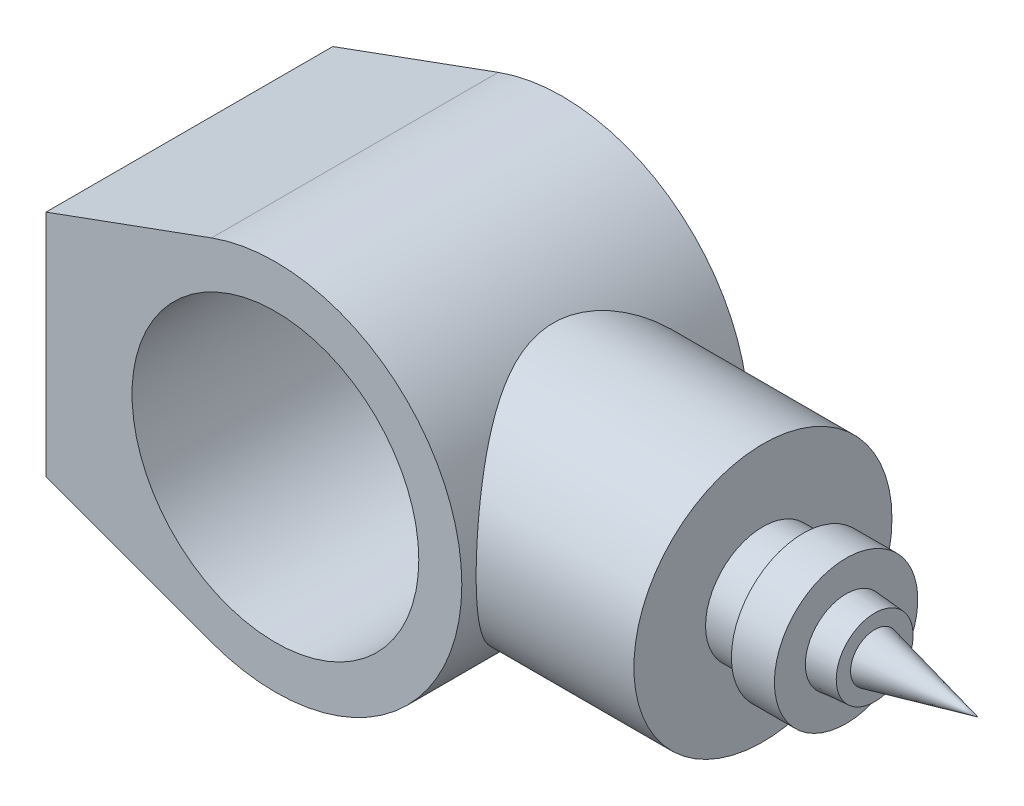
ISO-10303-21;
HEADER;
FILE_DESCRIPTION(('STEP AP214'),'2;1');
FILE_NAME('part.step','',(''),(''),'','','');
FILE_SCHEMA(('AUTOMOTIVE_DESIGN { 1 0 10303 214 1 1 1 1 }'));
ENDSEC;
DATA;
#1=APPLICATION_CONTEXT('core data for automotive mechanical design processes');
#2=APPLICATION_PROTOCOL_DEFINITION('international standard','automotive_design',2000,#1);
#3=PRODUCT_CONTEXT('',#1,'mechanical');
#4=PRODUCT('Part','Part','',(#3));
#5=PRODUCT_RELATED_PRODUCT_CATEGORY('part','',(#4));
#6=PRODUCT_DEFINITION_FORMATION('','',#4);
#7=PRODUCT_DEFINITION_CONTEXT('part definition',#1,'design');
#8=PRODUCT_DEFINITION('design','',#6,#7);
#9=PRODUCT_DEFINITION_SHAPE('','',#8);
#10=(LENGTH_UNIT() NAMED_UNIT(*) SI_UNIT(.MILLI.,.METRE.));
#11=(NAMED_UNIT(*) PLANE_ANGLE_UNIT() SI_UNIT($,.RADIAN.));
#12=(NAMED_UNIT(*) SI_UNIT($,.STERADIAN.) SOLID_ANGLE_UNIT());
#13=UNCERTAINTY_MEASURE_WITH_UNIT(LENGTH_MEASURE(1.E-05),#10,'distance_accuracy_value','');
#14=(GEOMETRIC_REPRESENTATION_CONTEXT(3) GLOBAL_UNCERTAINTY_ASSIGNED_CONTEXT((#13)) GLOBAL_UNIT_ASSIGNED_CONTEXT((#10,
#11,#12)) REPRESENTATION_CONTEXT('',''));
#15=CARTESIAN_POINT('',(0.,0.,0.));
#16=DIRECTION('',(0.,0.,1.));
#17=DIRECTION('',(1.,0.,0.));
#18=AXIS2_PLACEMENT_3D('',#15,#16,#17);
#19=CARTESIAN_POINT('',(0.,0.,50.));
#20=DIRECTION('',(0.,0.,1.));
#21=DIRECTION('',(1.,0.,0.));
#22=AXIS2_PLACEMENT_3D('',#19,#20,#21);
#23=PLANE('',#22);
#24=CARTESIAN_POINT('',(0.,0.,50.));
#25=DIRECTION('',(0.,0.,1.));
#26=DIRECTION('',(1.,0.,0.));
#27=AXIS2_PLACEMENT_3D('',#24,#25,#26);
#28=CIRCLE('',#27,65.);
#29=CARTESIAN_POINT('',(-22.2816656929027,-61.0616686141947,50.));
#30=VERTEX_POINT('',#29);
#31=CARTESIAN_POINT('',(-22.2816656929027,61.0616686141946,50.));
#32=VERTEX_POINT('',#31);
#33=EDGE_CURVE('E198',#30,#32,#28,.T.);
#34=ORIENTED_EDGE('',*,*,#33,.T.);
#35=DIRECTION('',(-0.939410286372225,-0.342794856813887,0.));
#36=VECTOR('',#35,1.);
#37=CARTESIAN_POINT('',(-80.,40.,50.));
#38=LINE('',#37,#36);
#39=CARTESIAN_POINT('',(-80.,40.,50.));
#40=VERTEX_POINT('',#39);
#41=EDGE_CURVE('E85',#32,#40,#38,.T.);
#42=ORIENTED_EDGE('',*,*,#41,.T.);
#43=DIRECTION('',(0.,-1.,0.));
#44=VECTOR('',#43,1.);
#45=CARTESIAN_POINT('',(-80.,-40.,50.));
#46=LINE('',#45,#44);
#47=CARTESIAN_POINT('',(-80.,-40.,50.));
#48=VERTEX_POINT('',#47);
#49=EDGE_CURVE('E194',#40,#48,#46,.T.);
#50=ORIENTED_EDGE('',*,*,#49,.T.);
#51=DIRECTION('',(0.939410286372225,-0.342794856813887,0.));
#52=VECTOR('',#51,1.);
#53=CARTESIAN_POINT('',(-80.,-40.,50.));
#54=LINE('',#53,#52);
#55=EDGE_CURVE('E54',#48,#30,#54,.T.);
#56=ORIENTED_EDGE('',*,*,#55,.T.);
#57=EDGE_LOOP('',(#34,#42,#50,#56));
#58=FACE_BOUND('',#57,.T.);
#59=CARTESIAN_POINT('',(0.,0.,50.));
#60=DIRECTION('',(0.,0.,1.));
#61=DIRECTION('',(1.,0.,0.));
#62=AXIS2_PLACEMENT_3D('',#59,#60,#61);
#63=CIRCLE('',#62,50.);
#64=CARTESIAN_POINT('',(50.,0.,50.));
#65=VERTEX_POINT('',#64);
#66=EDGE_CURVE('E130',#65,#65,#63,.T.);
#67=ORIENTED_EDGE('',*,*,#66,.F.);
#68=EDGE_LOOP('',(#67));
#69=FACE_BOUND('',#68,.T.);
#70=ADVANCED_FACE('F37',(#58,#69),#23,.T.);
#71=CARTESIAN_POINT('',(0.,0.,-50.));
#72=DIRECTION('',(0.,0.,1.));
#73=DIRECTION('',(1.,0.,0.));
#74=AXIS2_PLACEMENT_3D('',#71,#72,#73);
#75=PLANE('',#74);
#76=CARTESIAN_POINT('',(0.,0.,-50.));
#77=DIRECTION('',(0.,0.,1.));
#78=DIRECTION('',(1.,0.,0.));
#79=AXIS2_PLACEMENT_3D('',#76,#77,#78);
#80=CIRCLE('',#79,65.);
#81=CARTESIAN_POINT('',(-22.2816656929027,-61.0616686141947,-50.));
#82=VERTEX_POINT('',#81);
#83=CARTESIAN_POINT('',(-22.2816656929027,61.0616686141946,-50.));
#84=VERTEX_POINT('',#83);
#85=EDGE_CURVE('E192',#82,#84,#80,.T.);
#86=ORIENTED_EDGE('',*,*,#85,.F.);
#87=DIRECTION('',(0.939410286372225,-0.342794856813887,0.));
#88=VECTOR('',#87,1.);
#89=CARTESIAN_POINT('',(-80.,-40.,-50.));
#90=LINE('',#89,#88);
#91=CARTESIAN_POINT('',(-80.,-40.,-50.));
#92=VERTEX_POINT('',#91);
#93=EDGE_CURVE('E78',#92,#82,#90,.T.);
#94=ORIENTED_EDGE('',*,*,#93,.F.);
#95=DIRECTION('',(0.,-1.,0.));
#96=VECTOR('',#95,1.);
#97=CARTESIAN_POINT('',(-80.,-40.,-50.));
#98=LINE('',#97,#96);
#99=CARTESIAN_POINT('',(-80.,40.,-50.));
#100=VERTEX_POINT('',#99);
#101=EDGE_CURVE('E72',#100,#92,#98,.T.);
#102=ORIENTED_EDGE('',*,*,#101,.F.);
#103=DIRECTION('',(-0.939410286372225,-0.342794856813887,0.));
#104=VECTOR('',#103,1.);
#105=CARTESIAN_POINT('',(-80.,40.,-50.));
#106=LINE('',#105,#104);
#107=EDGE_CURVE('E187',#84,#100,#106,.T.);
#108=ORIENTED_EDGE('',*,*,#107,.F.);
#109=EDGE_LOOP('',(#86,#94,#102,#108));
#110=FACE_BOUND('',#109,.T.);
#111=CARTESIAN_POINT('',(0.,0.,-50.));
#112=DIRECTION('',(0.,0.,1.));
#113=DIRECTION('',(1.,0.,0.));
#114=AXIS2_PLACEMENT_3D('',#111,#112,#113);
#115=CIRCLE('',#114,50.);
#116=CARTESIAN_POINT('',(50.,0.,-50.));
#117=VERTEX_POINT('',#116);
#118=EDGE_CURVE('E122',#117,#117,#115,.T.);
#119=ORIENTED_EDGE('',*,*,#118,.T.);
#120=EDGE_LOOP('',(#119));
#121=FACE_BOUND('',#120,.T.);
#122=ADVANCED_FACE('F167',(#110,#121),#75,.F.);
#123=CARTESIAN_POINT('',(0.,0.,50.));
#124=DIRECTION('',(0.,0.,-1.));
#125=DIRECTION('',(-1.,0.,0.));
#126=AXIS2_PLACEMENT_3D('',#123,#124,#125);
#127=CYLINDRICAL_SURFACE('',#126,65.);
#128=CARTESIAN_POINT('',(65.,0.,-45.));
#129=CARTESIAN_POINT('',(65.0000011696057,1.12147330120565,-45.0000012025283));
#130=CARTESIAN_POINT('',(64.9709159765212,2.24292945230778,-44.9580201602482));
#131=CARTESIAN_POINT('',(64.8553068641383,4.47658414079082,-44.790785609369));
#132=CARTESIAN_POINT('',(64.7687842573088,5.58878288911931,-44.6655340035371));
#133=CARTESIAN_POINT('',(64.5403785763001,7.79555151848628,-44.3336771879691));
#134=CARTESIAN_POINT('',(64.3984760503456,8.89011506447751,-44.1270433931238));
#135=CARTESIAN_POINT('',(64.0626457436966,11.0533096019768,-43.6354760134034));
#136=CARTESIAN_POINT('',(63.8687169569864,12.1219400915896,-43.3505409144375));
#137=CARTESIAN_POINT('',(63.4342222744662,14.2212125160505,-42.7078017297046));
#138=CARTESIAN_POINT('',(63.1938918545645,15.2520162370063,-42.3503651251477));
#139=CARTESIAN_POINT('',(62.6709259446924,17.2756280115286,-41.5659763086892));
#140=CARTESIAN_POINT('',(62.3882907364915,18.268436318107,-41.1390245597888));
#141=CARTESIAN_POINT('',(61.786108553932,20.2116697228795,-40.2199419970838));
#142=CARTESIAN_POINT('',(61.4665619062631,21.1620951960855,-39.7278117601444));
#143=CARTESIAN_POINT('',(60.7962171584065,23.0172309124314,-38.6825647509799));
#144=CARTESIAN_POINT('',(60.4454175300334,23.9219389167185,-38.1294449962195));
#145=CARTESIAN_POINT('',(59.6865648974474,25.7601880140228,-36.9151737617935));
#146=CARTESIAN_POINT('',(59.27618815402,26.6893215363404,-36.2488040005491));
#147=CARTESIAN_POINT('',(58.4330275057249,28.4880338622967,-34.8529502059224));
#148=CARTESIAN_POINT('',(58.0002425478181,29.3576098626539,-34.1234632053608));
#149=CARTESIAN_POINT('',(57.1195111836477,31.0364486388513,-32.6040251352403));
#150=CARTESIAN_POINT('',(56.6715447181891,31.8456267033451,-31.8139921794123));
#151=CARTESIAN_POINT('',(55.7691986061138,33.4006700551814,-30.1773036556993));
#152=CARTESIAN_POINT('',(55.3148185876119,34.1465316534289,-29.3306447936721));
#153=CARTESIAN_POINT('',(54.3303114345595,35.6959084068904,-27.4326466159468));
#154=CARTESIAN_POINT('',(53.8005937511269,36.4872853280241,-26.3711450656527));
#155=CARTESIAN_POINT('',(52.7593327891933,37.9773509509911,-24.17604025639));
#156=CARTESIAN_POINT('',(52.2477941160227,38.6760162868262,-23.0424189272517));
#157=CARTESIAN_POINT('',(51.2608149265043,39.9749077721744,-20.7072341856928));
#158=CARTESIAN_POINT('',(50.7853275075273,40.5752630453964,-19.5057627267967));
#159=CARTESIAN_POINT('',(49.8892399163793,41.6721166930025,-17.036931864064));
#160=CARTESIAN_POINT('',(49.4686114171658,42.1686687478853,-15.7696069409943));
#161=CARTESIAN_POINT('',(48.8208029416879,42.9149535309565,-13.5723996352816));
#162=CARTESIAN_POINT('',(48.5738420263557,43.1936925213245,-12.6581208440976));
#163=CARTESIAN_POINT('',(48.1238801744123,43.6944569649788,-10.8035389223551));
#164=CARTESIAN_POINT('',(47.9208721021929,43.9164916250901,-9.86324004407419));
#165=CARTESIAN_POINT('',(47.5660754926548,44.3005296261305,-7.96250438663409));
#166=CARTESIAN_POINT('',(47.4142038087044,44.4626304606427,-7.00210302149487));
#167=CARTESIAN_POINT('',(47.1671263845177,44.7246555122386,-5.06554052628518));
#168=CARTESIAN_POINT('',(47.0719206259529,44.824579749433,-4.08937940131224));
#169=CARTESIAN_POINT('',(46.9418899090943,44.9607388198673,-2.1232364847967));
#170=CARTESIAN_POINT('',(46.9073939345417,44.9966266570423,-1.13320851844658));
#171=CARTESIAN_POINT('',(46.9013571135476,45.0029190462422,0.847248377093852));
#172=CARTESIAN_POINT('',(46.9298161498631,44.9733237202183,1.837677305534));
#173=CARTESIAN_POINT('',(47.0484302849821,44.8492190899201,3.81128752429081));
#174=CARTESIAN_POINT('',(47.13862305521,44.7546701492421,4.79446401850661));
#175=CARTESIAN_POINT('',(47.3768313176079,44.5024241630868,6.74551496467455));
#176=CARTESIAN_POINT('',(47.5248480621437,44.3447257499009,7.71338908473168));
#177=CARTESIAN_POINT('',(47.8621764271841,43.9803320764262,9.56919366964684));
#178=CARTESIAN_POINT('',(48.0484149088864,43.7772163066585,10.4583970625519));
#179=CARTESIAN_POINT('',(48.4609441046406,43.32010640119,12.2144143492181));
#180=CARTESIAN_POINT('',(48.6872496045115,43.0660934784815,13.0812198417583));
#181=CARTESIAN_POINT('',(49.1738509640383,42.5096331932465,14.7898225666927));
#182=CARTESIAN_POINT('',(49.4341648638834,42.2071601049958,15.6316062329481));
#183=CARTESIAN_POINT('',(49.9825182796335,41.5563350032134,17.2876417419013));
#184=CARTESIAN_POINT('',(50.2705534011697,41.2079902580444,18.1018979206949));
#185=CARTESIAN_POINT('',(51.0225431471345,40.2767822129268,20.1137766396802));
#186=CARTESIAN_POINT('',(51.5007434523328,39.6654891440572,21.2930273345177));
#187=CARTESIAN_POINT('',(52.4891158781477,38.348029920852,23.5833678403921));
#188=CARTESIAN_POINT('',(52.9993005340589,37.6418264436726,24.6944305853524));
#189=CARTESIAN_POINT('',(54.0361557973494,36.1376496350166,26.8476775780095));
#190=CARTESIAN_POINT('',(54.5628535785461,35.3395185623559,27.8897384505711));
#191=CARTESIAN_POINT('',(55.6171804467178,33.6558443419671,29.8998791095632));
#192=CARTESIAN_POINT('',(56.1448094104418,32.7703120184234,30.8679680307498));
#193=CARTESIAN_POINT('',(57.1932449701135,30.9045304086319,32.7363921475659));
#194=CARTESIAN_POINT('',(57.7139191350983,29.9233731295192,33.6358963165067));
#195=CARTESIAN_POINT('',(58.7296419536465,27.8771206485979,35.350355349792));
#196=CARTESIAN_POINT('',(59.2246882700661,26.8120178135979,36.1653025097018));
#197=CARTESIAN_POINT('',(60.1756566955639,24.6035209522421,37.7024332048813));
#198=CARTESIAN_POINT('',(60.6316475651595,23.4602711709794,38.4247809320632));
#199=CARTESIAN_POINT('',(61.4931891608211,21.0989507187335,39.7703323765769));
#200=CARTESIAN_POINT('',(61.898755017873,19.8809026570889,40.3935658507715));
#201=CARTESIAN_POINT('',(62.5646802947783,17.6549035875762,41.4059204565395));
#202=CARTESIAN_POINT('',(62.8372982548467,16.6602403417733,41.8163120535009));
#203=CARTESIAN_POINT('',(63.3397164077328,14.6345031625144,42.5675669112335));
#204=CARTESIAN_POINT('',(63.569522535998,13.603434299959,42.9084398107234));
#205=CARTESIAN_POINT('',(63.9815049902596,11.5110112910016,43.5164676119118));
#206=CARTESIAN_POINT('',(64.1637052650743,10.4496726714621,43.7836595836378));
#207=CARTESIAN_POINT('',(64.476639865795,8.30296993183371,44.2409869387356));
#208=CARTESIAN_POINT('',(64.6073730982257,7.21760530180254,44.431120684921));
#209=CARTESIAN_POINT('',(64.8147345736682,5.02649787175023,44.7321113931983));
#210=CARTESIAN_POINT('',(64.8911534961694,3.92069290489763,44.8426616714377));
#211=CARTESIAN_POINT('',(64.9872183357685,1.70145350776208,44.981563734156));
#212=CARTESIAN_POINT('',(65.0068642771874,0.588019080747696,45.0099155538474));
#213=CARTESIAN_POINT('',(64.9889001241945,-1.63741781931566,44.9839662509349));
#214=CARTESIAN_POINT('',(64.9512898349751,-2.74942028747967,44.929664847113));
#215=CARTESIAN_POINT('',(64.819734418053,-4.96298947367603,44.7392747901952));
#216=CARTESIAN_POINT('',(64.7257910494465,-6.06455651648127,44.6031886909653));
#217=CARTESIAN_POINT('',(64.491175703309,-8.18254449212149,44.2620157992034));
#218=CARTESIAN_POINT('',(64.3536808680178,-9.20007959997774,44.0616107864454));
#219=CARTESIAN_POINT('',(64.0337856060908,-11.2121337136589,43.5930613516679));
#220=CARTESIAN_POINT('',(63.8513873855499,-12.2066538475799,43.3249202574929));
#221=CARTESIAN_POINT('',(63.4451725249075,-14.1673074608523,42.7239854011605));
#222=CARTESIAN_POINT('',(63.2213525684632,-15.1334386601223,42.3911864622047));
#223=CARTESIAN_POINT('',(62.736336352677,-17.0327019487273,41.6643868113868));
#224=CARTESIAN_POINT('',(62.4751380044848,-17.965832190203,41.2703826790343));
#225=CARTESIAN_POINT('',(61.8990085085122,-19.8637431772395,40.3931275129008));
#226=CARTESIAN_POINT('',(61.5815209528501,-20.8256806929253,39.9054081529014));
#227=CARTESIAN_POINT('',(60.9142086391395,-22.7035764997345,38.8677076181211));
#228=CARTESIAN_POINT('',(60.5643826081083,-23.6195329786528,38.3177239921568));
#229=CARTESIAN_POINT('',(59.8381347129401,-25.4032558353403,37.1592008079418));
#230=CARTESIAN_POINT('',(59.4616987975441,-26.270996314329,36.5506302507532));
#231=CARTESIAN_POINT('',(58.6884577670336,-27.9557544991496,35.2787474176625));
#232=CARTESIAN_POINT('',(58.2916515549571,-28.7727694681138,34.6154321925309));
#233=CARTESIAN_POINT('',(57.4151711853793,-30.4889708749912,33.1199200847161));
#234=CARTESIAN_POINT('',(56.9328754552547,-31.3785212006928,32.2781812569548));
#235=CARTESIAN_POINT('',(55.9590893109094,-33.0839042215169,30.5278352445589));
#236=CARTESIAN_POINT('',(55.4675975421249,-33.8997259516808,29.6192181500899));
#237=CARTESIAN_POINT('',(54.4860350387397,-35.45586994741,27.7375714933993));
#238=CARTESIAN_POINT('',(53.9959654596117,-36.1961418986443,26.7644997080007));
#239=CARTESIAN_POINT('',(53.0294834997435,-37.5978502361011,24.7568233036382));
#240=CARTESIAN_POINT('',(52.553069328415,-38.2592969946585,23.7222268074148));
#241=CARTESIAN_POINT('',(51.679941347726,-39.4291013564639,21.7149007388747));
#242=CARTESIAN_POINT('',(51.2803372484816,-39.9463152685162,20.7485884228094));
#243=CARTESIAN_POINT('',(50.5123974548912,-40.9130636661729,18.7705314851885));
#244=CARTESIAN_POINT('',(50.1440619804653,-41.3625976757848,17.7587865441704));
#245=CARTESIAN_POINT('',(49.4504928922364,-42.1893301292689,15.693797265063));
#246=CARTESIAN_POINT('',(49.1251906412473,-42.566644202947,14.6406225749502));
#247=CARTESIAN_POINT('',(48.5290098021012,-43.2451098617227,12.4950157035289));
#248=CARTESIAN_POINT('',(48.2581179989952,-43.5462799449171,11.4025931307277));
#249=CARTESIAN_POINT('',(47.8271610412375,-44.0186874861181,9.3921629994351));
#250=CARTESIAN_POINT('',(47.6558419905218,-44.2036946073207,8.47979353570419));
#251=CARTESIAN_POINT('',(47.3627606953031,-44.517583244497,6.63757582668245));
#252=CARTESIAN_POINT('',(47.2409923142224,-44.6464717105955,5.70772976070373));
#253=CARTESIAN_POINT('',(47.05166615705,-44.8459556683364,3.83718735816971));
#254=CARTESIAN_POINT('',(46.9840561376509,-44.9166073394187,2.89650236820514));
#255=CARTESIAN_POINT('',(46.9055698265682,-44.9985645522097,1.01014116515035));
#256=CARTESIAN_POINT('',(46.894694331428,-45.0098692606967,0.0644648821697862));
#257=CARTESIAN_POINT('',(46.9301408777119,-44.972908524549,-1.82506201386804));
#258=CARTESIAN_POINT('',(46.9764888551696,-44.9246160680299,-2.76891160474201));
#259=CARTESIAN_POINT('',(47.1245232303033,-44.7693052695385,-4.64731891289862));
#260=CARTESIAN_POINT('',(47.226209296244,-44.6622872796082,-5.58187668584874));
#261=CARTESIAN_POINT('',(47.4811423262629,-44.3911660407895,-7.43666598606561));
#262=CARTESIAN_POINT('',(47.634452919394,-44.2269923369625,-8.35687836049678));
#263=CARTESIAN_POINT('',(47.9871889035597,-43.8440109221367,-10.1768310643423));
#264=CARTESIAN_POINT('',(48.1866204648689,-43.6251959006593,-11.0765686368372));
#265=CARTESIAN_POINT('',(48.6908782922366,-43.0625185245671,-13.116726178063));
#266=CARTESIAN_POINT('',(49.0093972350599,-42.7008255731353,-14.2488681052183));
#267=CARTESIAN_POINT('',(49.699554494161,-41.8955268796886,-16.4668795226373));
#268=CARTESIAN_POINT('',(50.0712093704162,-41.4518955887103,-17.5527344499461));
#269=CARTESIAN_POINT('',(50.8544123719762,-40.4872212981013,-19.6760329984318));
#270=CARTESIAN_POINT('',(51.2660067549033,-39.9660881554129,-20.7134183727638));
#271=CARTESIAN_POINT('',(52.116211879306,-38.8508952329155,-22.7363587217865));
#272=CARTESIAN_POINT('',(52.5548209260535,-38.2568400254561,-23.7219169406072));
#273=CARTESIAN_POINT('',(53.4579357785502,-36.9847423381263,-25.6613286822633));
#274=CARTESIAN_POINT('',(53.9228021101371,-36.3051118639051,-26.6139712103077));
#275=CARTESIAN_POINT('',(54.8583333343946,-34.8753950985048,-28.4617532840731));
#276=CARTESIAN_POINT('',(55.3289982185488,-34.1253089107936,-29.3568929142368));
#277=CARTESIAN_POINT('',(56.2664339133503,-32.5564691651912,-31.0876310121466));
#278=CARTESIAN_POINT('',(56.7332035093429,-31.7376950080829,-31.923211478402));
#279=CARTESIAN_POINT('',(57.6535165855435,-30.033481652025,-33.5315189390535));
#280=CARTESIAN_POINT('',(58.1070588196762,-29.1480362003111,-34.3042400240121));
#281=CARTESIAN_POINT('',(59.0635284336244,-27.1643113596245,-35.9022819462667));
#282=CARTESIAN_POINT('',(59.5626106290919,-26.0547472869609,-36.7159606163356));
#283=CARTESIAN_POINT('',(60.5176757229357,-23.7521280348398,-38.2458641369291));
#284=CARTESIAN_POINT('',(60.9736519283074,-22.5590599397198,-38.962073861155));
#285=CARTESIAN_POINT('',(61.6149926579414,-20.7127348127311,-39.9558623322098));
#286=CARTESIAN_POINT('',(61.8215919655179,-20.088110583999,-40.2735888165198));
#287=CARTESIAN_POINT('',(62.2191547005856,-18.8206694867556,-40.8812436548858));
#288=CARTESIAN_POINT('',(62.4101203779565,-18.1778552539997,-41.1711760099034));
#289=CARTESIAN_POINT('',(62.7748527233683,-16.875283117665,-41.7219931318356));
#290=CARTESIAN_POINT('',(62.9486230408552,-16.2155288469421,-41.9828840638124));
#291=CARTESIAN_POINT('',(63.2775356475737,-14.8804011558233,-42.4744610119283));
#292=CARTESIAN_POINT('',(63.432679284421,-14.2050288695917,-42.7051492133046));
#293=CARTESIAN_POINT('',(63.8070721968101,-12.4447010544915,-43.25974494481));
#294=CARTESIAN_POINT('',(64.0114184468014,-11.3490405228654,-43.5602757498286));
#295=CARTESIAN_POINT('',(64.3654191982087,-9.12991345978806,-44.078827644396));
#296=CARTESIAN_POINT('',(64.5150820049425,-8.00645117856259,-44.2968612637911));
#297=CARTESIAN_POINT('',(64.7559993187061,-5.74082253729113,-44.6470112993716));
#298=CARTESIAN_POINT('',(64.847297757104,-4.59867091062173,-44.7791923387443));
#299=CARTESIAN_POINT('',(64.9692976296881,-2.30434018473195,-44.9556862638234));
#300=CARTESIAN_POINT('',(64.9999987983895,-1.15216104160189,-44.999998764566));
#301=CARTESIAN_POINT('',(65.,0.,-45.));
#302=B_SPLINE_CURVE_WITH_KNOTS('',3,(#128,#129,#130,#131,#132,#133,#134,#135,#136,#137,#138,
#139,#140,#141,#142,#143,#144,#145,#146,#147,#148,#149,#150,#151,#152,#153,#154,#155,#156,#157,
#158,#159,#160,#161,#162,#163,#164,#165,#166,#167,#168,#169,#170,#171,#172,#173,#174,#175,#176,
#177,#178,#179,#180,#181,#182,#183,#184,#185,#186,#187,#188,#189,#190,#191,#192,#193,#194,#195,
#196,#197,#198,#199,#200,#201,#202,#203,#204,#205,#206,#207,#208,#209,#210,#211,#212,#213,#214,
#215,#216,#217,#218,#219,#220,#221,#222,#223,#224,#225,#226,#227,#228,#229,#230,#231,#232,#233,
#234,#235,#236,#237,#238,#239,#240,#241,#242,#243,#244,#245,#246,#247,#248,#249,#250,#251,#252,
#253,#254,#255,#256,#257,#258,#259,#260,#261,#262,#263,#264,#265,#266,#267,#268,#269,#270,#271,
#272,#273,#274,#275,#276,#277,#278,#279,#280,#281,#282,#283,#284,#285,#286,#287,#288,#289,#290,
#291,#292,#293,#294,#295,#296,#297,#298,#299,#300,#301),.UNSPECIFIED.,.T.,.F.,(4,2,2,2,2,2,2,2,
2,2,2,2,2,2,2,2,2,2,2,2,2,2,2,2,2,2,2,2,2,2,2,2,2,2,2,2,2,2,2,2,2,2,2,2,2,2,2,2,2,2,2,2,2,2,2,2,
2,2,2,2,2,2,2,2,2,2,2,2,2,2,2,2,2,2,2,2,2,2,2,2,2,2,2,2,2,2,4),(0.,3.36323892794144,
6.72640100710137,10.0907454360665,13.4551549250109,16.8029195613731,20.1506619010729,
23.4983746134034,26.8462511096753,30.4871649037346,34.1282499524345,37.7743494260164,
41.4206611917409,45.6939383064405,49.9682903731881,54.2369825353392,58.5034617073671,
61.4625138492405,64.4210852373372,67.3748225577202,70.3285589227263,73.2982527376573,
76.2679410220407,79.2394430998938,82.2110095388412,85.0011411726389,87.7923045951578,
90.584954683776,93.3771628083065,97.6064034875675,101.837312178738,106.075592113262,
110.313347816192,114.596218662803,118.879479402292,123.155037051935,127.429308626693,
130.755998382163,134.082226580387,137.406778235214,140.731400520075,144.068767009318,
147.406132068879,150.743508483461,154.080780688207,157.215791533369,160.350648386749,
163.485756334407,166.621039552604,169.990545063149,173.360183268584,176.73161428665,
180.103227050672,184.047902440152,187.993163521895,191.94103513809,195.888386692538,
199.385185586645,202.88200907258,206.373186157811,209.863514294626,212.700365177753,
215.536864625513,218.370624567028,221.204424293963,224.039508887241,226.874576485218,
229.713151272815,232.55210603787,236.23803941247,239.925124033801,243.616531168718,
247.307706963636,251.081871120678,254.856029735252,258.631324277359,262.406973327354,
266.792058434818,271.177823293658,273.368885604935,275.55963203795,277.749912517597,
279.940034437727,283.398420446896,286.856280978073,290.31153567335,293.766805506531),.UNSPECIFIED.);
#303=CARTESIAN_POINT('',(65.,0.,-45.));
#304=VERTEX_POINT('',#303);
#305=EDGE_CURVE('E118',#304,#304,#302,.T.);
#306=ORIENTED_EDGE('',*,*,#305,.F.);
#307=EDGE_LOOP('',(#306));
#308=FACE_BOUND('',#307,.T.);
#309=ORIENTED_EDGE('',*,*,#85,.T.);
#310=DIRECTION('',(0.,0.,-1.));
#311=VECTOR('',#310,1.);
#312=CARTESIAN_POINT('',(-22.2816656929027,61.0616686141946,50.));
#313=LINE('',#312,#311);
#314=EDGE_CURVE('E11',#32,#84,#313,.T.);
#315=ORIENTED_EDGE('',*,*,#314,.F.);
#316=ORIENTED_EDGE('',*,*,#33,.F.);
#317=DIRECTION('',(0.,0.,-1.));
#318=VECTOR('',#317,1.);
#319=CARTESIAN_POINT('',(-22.2816656929027,-61.0616686141947,50.));
#320=LINE('',#319,#318);
#321=EDGE_CURVE('E202',#30,#82,#320,.T.);
#322=ORIENTED_EDGE('',*,*,#321,.T.);
#323=EDGE_LOOP('',(#309,#315,#316,#322));
#324=FACE_BOUND('',#323,.T.);
#325=ADVANCED_FACE('F39',(#308,#324),#127,.T.);
#326=CARTESIAN_POINT('',(-80.,40.,50.));
#327=DIRECTION('',(0.342794856813887,-0.939410286372225,0.));
#328=DIRECTION('',(0.939410286372225,0.342794856813887,0.));
#329=AXIS2_PLACEMENT_3D('',#326,#327,#328);
#330=PLANE('',#329);
#331=ORIENTED_EDGE('',*,*,#107,.T.);
#332=DIRECTION('',(0.,0.,-1.));
#333=VECTOR('',#332,1.);
#334=CARTESIAN_POINT('',(-80.,40.,50.));
#335=LINE('',#334,#333);
#336=EDGE_CURVE('E46',#40,#100,#335,.T.);
#337=ORIENTED_EDGE('',*,*,#336,.F.);
#338=ORIENTED_EDGE('',*,*,#41,.F.);
#339=ORIENTED_EDGE('',*,*,#314,.T.);
#340=EDGE_LOOP('',(#331,#337,#338,#339));
#341=FACE_BOUND('',#340,.T.);
#342=ADVANCED_FACE('F181',(#341),#330,.F.);
#343=CARTESIAN_POINT('',(-80.,-40.,50.));
#344=DIRECTION('',(1.,0.,0.));
#345=DIRECTION('',(0.,0.,-1.));
#346=AXIS2_PLACEMENT_3D('',#343,#344,#345);
#347=PLANE('',#346);
#348=ORIENTED_EDGE('',*,*,#101,.T.);
#349=DIRECTION('',(0.,0.,-1.));
#350=VECTOR('',#349,1.);
#351=CARTESIAN_POINT('',(-80.,-40.,50.));
#352=LINE('',#351,#350);
#353=EDGE_CURVE('E195',#48,#92,#352,.T.);
#354=ORIENTED_EDGE('',*,*,#353,.F.);
#355=ORIENTED_EDGE('',*,*,#49,.F.);
#356=ORIENTED_EDGE('',*,*,#336,.T.);
#357=EDGE_LOOP('',(#348,#354,#355,#356));
#358=FACE_BOUND('',#357,.T.);
#359=ADVANCED_FACE('F179',(#358),#347,.F.);
#360=CARTESIAN_POINT('',(-80.,-40.,50.));
#361=DIRECTION('',(0.342794856813887,0.939410286372225,0.));
#362=DIRECTION('',(-0.939410286372225,0.342794856813887,0.));
#363=AXIS2_PLACEMENT_3D('',#360,#361,#362);
#364=PLANE('',#363);
#365=ORIENTED_EDGE('',*,*,#93,.T.);
#366=ORIENTED_EDGE('',*,*,#321,.F.);
#367=ORIENTED_EDGE('',*,*,#55,.F.);
#368=ORIENTED_EDGE('',*,*,#353,.T.);
#369=EDGE_LOOP('',(#365,#366,#367,#368));
#370=FACE_BOUND('',#369,.T.);
#371=ADVANCED_FACE('F176',(#370),#364,.F.);
#372=CARTESIAN_POINT('',(0.,0.,50.));
#373=DIRECTION('',(0.,0.,-1.));
#374=DIRECTION('',(-1.,0.,0.));
#375=AXIS2_PLACEMENT_3D('',#372,#373,#374);
#376=CYLINDRICAL_SURFACE('',#375,50.);
#377=ORIENTED_EDGE('',*,*,#66,.T.);
#378=EDGE_LOOP('',(#377));
#379=FACE_BOUND('',#378,.T.);
#380=ORIENTED_EDGE('',*,*,#118,.F.);
#381=EDGE_LOOP('',(#380));
#382=FACE_BOUND('',#381,.T.);
#383=ADVANCED_FACE('F140',(#379,#382),#376,.F.);
#384=CARTESIAN_POINT('',(120.,0.,0.));
#385=DIRECTION('',(1.,0.,0.));
#386=DIRECTION('',(0.,0.,-1.));
#387=AXIS2_PLACEMENT_3D('',#384,#385,#386);
#388=PLANE('',#387);
#389=CARTESIAN_POINT('',(120.,0.,0.));
#390=DIRECTION('',(-1.,0.,0.));
#391=DIRECTION('',(0.,0.,1.));
#392=AXIS2_PLACEMENT_3D('',#389,#390,#391);
#393=CIRCLE('',#392,20.);
#394=CARTESIAN_POINT('',(120.,0.,20.));
#395=VERTEX_POINT('',#394);
#396=EDGE_CURVE('E115',#395,#395,#393,.T.);
#397=ORIENTED_EDGE('',*,*,#396,.T.);
#398=EDGE_LOOP('',(#397));
#399=FACE_BOUND('',#398,.T.);
#400=CARTESIAN_POINT('',(120.,0.,0.));
#401=DIRECTION('',(1.,0.,0.));
#402=DIRECTION('',(0.,0.,-1.));
#403=AXIS2_PLACEMENT_3D('',#400,#401,#402);
#404=CIRCLE('',#403,45.);
#405=CARTESIAN_POINT('',(120.,0.,-45.));
#406=VERTEX_POINT('',#405);
#407=EDGE_CURVE('E119',#406,#406,#404,.T.);
#408=ORIENTED_EDGE('',*,*,#407,.T.);
#409=EDGE_LOOP('',(#408));
#410=FACE_BOUND('',#409,.T.);
#411=ADVANCED_FACE('F137',(#399,#410),#388,.T.);
#412=CARTESIAN_POINT('',(-80.002,0.,0.));
#413=DIRECTION('',(1.,0.,0.));
#414=DIRECTION('',(0.,0.,-1.));
#415=AXIS2_PLACEMENT_3D('',#412,#413,#414);
#416=CYLINDRICAL_SURFACE('',#415,45.);
#417=ORIENTED_EDGE('',*,*,#407,.F.);
#418=EDGE_LOOP('',(#417));
#419=FACE_BOUND('',#418,.T.);
#420=ORIENTED_EDGE('',*,*,#305,.T.);
#421=EDGE_LOOP('',(#420));
#422=FACE_BOUND('',#421,.T.);
#423=ADVANCED_FACE('F132',(#419,#422),#416,.T.);
#424=CARTESIAN_POINT('',(0.,0.,0.));
#425=DIRECTION('',(-1.,0.,0.));
#426=DIRECTION('',(0.,0.,1.));
#427=AXIS2_PLACEMENT_3D('',#424,#425,#426);
#428=CYLINDRICAL_SURFACE('',#427,20.);
#429=CARTESIAN_POINT('',(134.,0.,0.));
#430=DIRECTION('',(-1.,0.,0.));
#431=DIRECTION('',(0.,0.,1.));
#432=AXIS2_PLACEMENT_3D('',#429,#430,#431);
#433=CIRCLE('',#432,20.);
#434=CARTESIAN_POINT('',(134.,0.,20.));
#435=VERTEX_POINT('',#434);
#436=EDGE_CURVE('E112',#435,#435,#433,.T.);
#437=ORIENTED_EDGE('',*,*,#436,.T.);
#438=EDGE_LOOP('',(#437));
#439=FACE_BOUND('',#438,.T.);
#440=ORIENTED_EDGE('',*,*,#396,.F.);
#441=EDGE_LOOP('',(#440));
#442=FACE_BOUND('',#441,.T.);
#443=ADVANCED_FACE('F142',(#439,#442),#428,.T.);
#444=CARTESIAN_POINT('',(134.,-20.,0.));
#445=DIRECTION('',(-1.,0.,0.));
#446=DIRECTION('',(0.,0.,1.));
#447=AXIS2_PLACEMENT_3D('',#444,#445,#446);
#448=PLANE('',#447);
#449=CARTESIAN_POINT('',(134.,0.,0.));
#450=DIRECTION('',(-1.,0.,0.));
#451=DIRECTION('',(0.,0.,1.));
#452=AXIS2_PLACEMENT_3D('',#449,#450,#451);
#453=CIRCLE('',#452,25.);
#454=CARTESIAN_POINT('',(134.,0.,25.));
#455=VERTEX_POINT('',#454);
#456=EDGE_CURVE('E109',#455,#455,#453,.T.);
#457=ORIENTED_EDGE('',*,*,#456,.T.);
#458=EDGE_LOOP('',(#457));
#459=FACE_BOUND('',#458,.T.);
#460=ORIENTED_EDGE('',*,*,#436,.F.);
#461=EDGE_LOOP('',(#460));
#462=FACE_BOUND('',#461,.T.);
#463=ADVANCED_FACE('F145',(#459,#462),#448,.T.);
#464=CARTESIAN_POINT('',(0.,0.,0.));
#465=DIRECTION('',(-1.,0.,0.));
#466=DIRECTION('',(0.,0.,1.));
#467=AXIS2_PLACEMENT_3D('',#464,#465,#466);
#468=CYLINDRICAL_SURFACE('',#467,25.);
#469=CARTESIAN_POINT('',(149.,0.,0.));
#470=DIRECTION('',(-1.,0.,0.));
#471=DIRECTION('',(0.,0.,1.));
#472=AXIS2_PLACEMENT_3D('',#469,#470,#471);
#473=CIRCLE('',#472,25.);
#474=CARTESIAN_POINT('',(149.,0.,25.));
#475=VERTEX_POINT('',#474);
#476=EDGE_CURVE('E106',#475,#475,#473,.T.);
#477=ORIENTED_EDGE('',*,*,#476,.T.);
#478=EDGE_LOOP('',(#477));
#479=FACE_BOUND('',#478,.T.);
#480=ORIENTED_EDGE('',*,*,#456,.F.);
#481=EDGE_LOOP('',(#480));
#482=FACE_BOUND('',#481,.T.);
#483=ADVANCED_FACE('F149',(#479,#482),#468,.T.);
#484=CARTESIAN_POINT('',(149.,-25.,0.));
#485=DIRECTION('',(1.,0.,0.));
#486=DIRECTION('',(0.,0.,-1.));
#487=AXIS2_PLACEMENT_3D('',#484,#485,#486);
#488=PLANE('',#487);
#489=CARTESIAN_POINT('',(149.,0.,0.));
#490=DIRECTION('',(-1.,0.,0.));
#491=DIRECTION('',(0.,0.,1.));
#492=AXIS2_PLACEMENT_3D('',#489,#490,#491);
#493=CIRCLE('',#492,14.2078628313814);
#494=CARTESIAN_POINT('',(149.,0.,14.2078628313814));
#495=VERTEX_POINT('',#494);
#496=EDGE_CURVE('E101',#495,#495,#493,.T.);
#497=ORIENTED_EDGE('',*,*,#496,.T.);
#498=EDGE_LOOP('',(#497));
#499=FACE_BOUND('',#498,.T.);
#500=ORIENTED_EDGE('',*,*,#476,.F.);
#501=EDGE_LOOP('',(#500));
#502=FACE_BOUND('',#501,.T.);
#503=ADVANCED_FACE('F153',(#499,#502),#488,.T.);
#504=CARTESIAN_POINT('',(149.,0.,0.));
#505=DIRECTION('',(-1.,0.,0.));
#506=DIRECTION('',(0.,0.,1.));
#507=AXIS2_PLACEMENT_3D('',#504,#505,#506);
#508=CONICAL_SURFACE('',#507,14.2078628313814,0.0800936093073883);
#509=CARTESIAN_POINT('',(158.967942211761,0.,0.));
#510=DIRECTION('',(-1.,0.,0.));
#511=DIRECTION('',(0.,0.,1.));
#512=AXIS2_PLACEMENT_3D('',#509,#510,#511);
#513=CIRCLE('',#512,13.4077827960191);
#514=CARTESIAN_POINT('',(158.967942211761,0.,13.4077827960191));
#515=VERTEX_POINT('',#514);
#516=EDGE_CURVE('E98',#515,#515,#513,.T.);
#517=ORIENTED_EDGE('',*,*,#516,.T.);
#518=EDGE_LOOP('',(#517));
#519=FACE_BOUND('',#518,.T.);
#520=ORIENTED_EDGE('',*,*,#496,.F.);
#521=EDGE_LOOP('',(#520));
#522=FACE_BOUND('',#521,.T.);
#523=ADVANCED_FACE('F157',(#519,#522),#508,.T.);
#524=CARTESIAN_POINT('',(158.967942211761,-13.4077827960191,0.));
#525=DIRECTION('',(1.,0.,0.));
#526=DIRECTION('',(0.,0.,-1.));
#527=AXIS2_PLACEMENT_3D('',#524,#525,#526);
#528=PLANE('',#527);
#529=CARTESIAN_POINT('',(158.967942211761,0.,0.));
#530=DIRECTION('',(-1.,0.,0.));
#531=DIRECTION('',(0.,0.,1.));
#532=AXIS2_PLACEMENT_3D('',#529,#530,#531);
#533=CIRCLE('',#532,8.4077827960191);
#534=CARTESIAN_POINT('',(158.967942211761,0.,8.4077827960191));
#535=VERTEX_POINT('',#534);
#536=EDGE_CURVE('E96',#535,#535,#533,.T.);
#537=ORIENTED_EDGE('',*,*,#536,.T.);
#538=EDGE_LOOP('',(#537));
#539=FACE_BOUND('',#538,.T.);
#540=ORIENTED_EDGE('',*,*,#516,.F.);
#541=EDGE_LOOP('',(#540));
#542=FACE_BOUND('',#541,.T.);
#543=ADVANCED_FACE('F92',(#539,#542),#528,.T.);
#544=CARTESIAN_POINT('',(158.967942211761,0.,0.));
#545=DIRECTION('',(-1.,0.,0.));
#546=DIRECTION('',(0.,0.,1.));
#547=AXIS2_PLACEMENT_3D('',#544,#545,#546);
#548=CONICAL_SURFACE('',#547,8.4077827960191,0.229239898914611);
#549=CARTESIAN_POINT('',(195.,0.,0.));
#550=VERTEX_POINT('',#549);
#551=VERTEX_LOOP('',#550);
#552=FACE_BOUND('',#551,.T.);
#553=ORIENTED_EDGE('',*,*,#536,.F.);
#554=EDGE_LOOP('',(#553));
#555=FACE_BOUND('',#554,.T.);
#556=ADVANCED_FACE('F89',(#552,#555),#548,.T.);
#557=CLOSED_SHELL('',(#70,#122,#325,#342,#359,#371,#383,#411,#423,#443,#463,#483,#503,#523,#543,#556));
#558=MANIFOLD_SOLID_BREP('B2',#557);
#559=ADVANCED_BREP_SHAPE_REPRESENTATION('',(#18,#558),#14);
#560=SHAPE_DEFINITION_REPRESENTATION(#9,#559);
ENDSEC;
END-ISO-10303-21;
